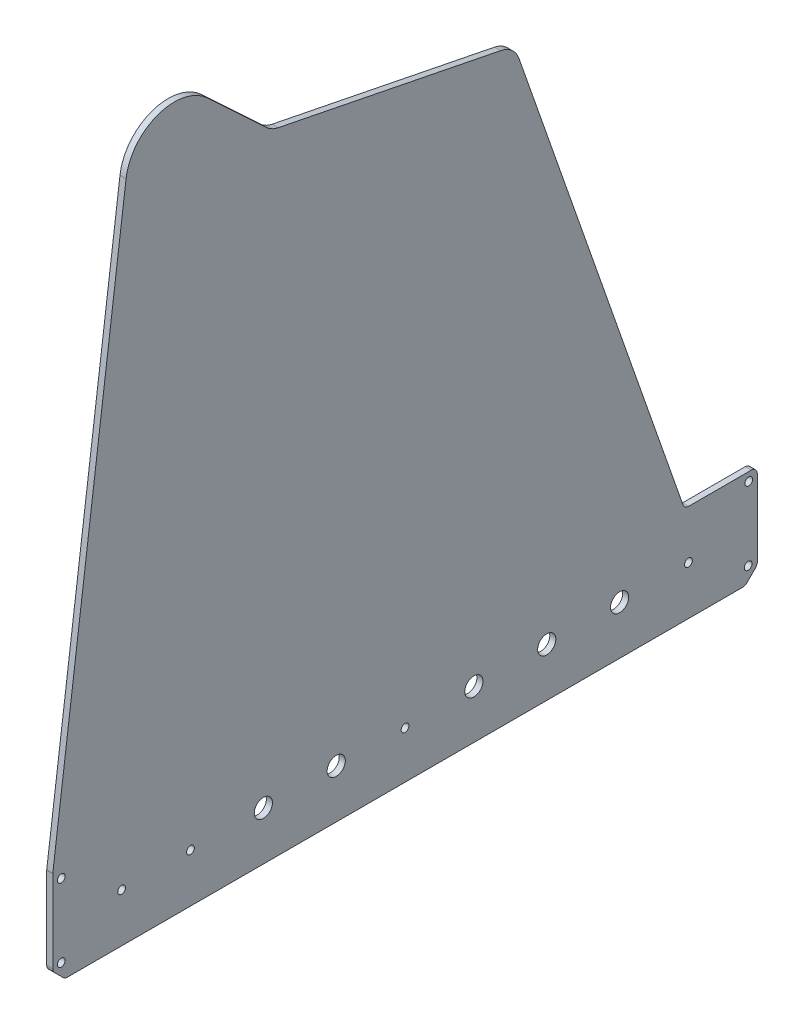
ISO-10303-21;
HEADER;
FILE_DESCRIPTION(('STEP AP214'),'2;1');
FILE_NAME('part.step','',(''),(''),'','','');
FILE_SCHEMA(('AUTOMOTIVE_DESIGN { 1 0 10303 214 1 1 1 1 }'));
ENDSEC;
DATA;
#1=APPLICATION_CONTEXT('core data for automotive mechanical design processes');
#2=APPLICATION_PROTOCOL_DEFINITION('international standard','automotive_design',2000,#1);
#3=PRODUCT_CONTEXT('',#1,'mechanical');
#4=PRODUCT('Part','Part','',(#3));
#5=PRODUCT_RELATED_PRODUCT_CATEGORY('part','',(#4));
#6=PRODUCT_DEFINITION_FORMATION('','',#4);
#7=PRODUCT_DEFINITION_CONTEXT('part definition',#1,'design');
#8=PRODUCT_DEFINITION('design','',#6,#7);
#9=PRODUCT_DEFINITION_SHAPE('','',#8);
#10=(LENGTH_UNIT() NAMED_UNIT(*) SI_UNIT(.MILLI.,.METRE.));
#11=(NAMED_UNIT(*) PLANE_ANGLE_UNIT() SI_UNIT($,.RADIAN.));
#12=(NAMED_UNIT(*) SI_UNIT($,.STERADIAN.) SOLID_ANGLE_UNIT());
#13=UNCERTAINTY_MEASURE_WITH_UNIT(LENGTH_MEASURE(1.E-05),#10,'distance_accuracy_value','');
#14=(GEOMETRIC_REPRESENTATION_CONTEXT(3) GLOBAL_UNCERTAINTY_ASSIGNED_CONTEXT((#13)) GLOBAL_UNIT_ASSIGNED_CONTEXT((#10,
#11,#12)) REPRESENTATION_CONTEXT('',''));
#15=CARTESIAN_POINT('',(0.,0.,0.));
#16=DIRECTION('',(0.,0.,1.));
#17=DIRECTION('',(1.,0.,0.));
#18=AXIS2_PLACEMENT_3D('',#15,#16,#17);
#19=CARTESIAN_POINT('',(0.,318.29375,120.65));
#20=DIRECTION('',(1.,0.,0.));
#21=DIRECTION('',(0.,0.,-1.));
#22=AXIS2_PLACEMENT_3D('',#19,#20,#21);
#23=PLANE('',#22);
#24=CARTESIAN_POINT('',(0.,21.74875,179.705));
#25=DIRECTION('',(1.,0.,0.));
#26=DIRECTION('',(0.,0.,-1.));
#27=AXIS2_PLACEMENT_3D('',#24,#25,#26);
#28=CIRCLE('',#27,2.032);
#29=CARTESIAN_POINT('',(0.,21.74875,177.673));
#30=VERTEX_POINT('',#29);
#31=EDGE_CURVE('E713',#30,#30,#28,.T.);
#32=ORIENTED_EDGE('',*,*,#31,.T.);
#33=EDGE_LOOP('',(#32));
#34=FACE_BOUND('',#33,.T.);
#35=CARTESIAN_POINT('',(0.,-16.4150707152516,179.705));
#36=DIRECTION('',(1.,0.,0.));
#37=DIRECTION('',(0.,0.,-1.));
#38=AXIS2_PLACEMENT_3D('',#35,#36,#37);
#39=CIRCLE('',#38,2.032);
#40=CARTESIAN_POINT('',(0.,-16.4150707152516,177.673));
#41=VERTEX_POINT('',#40);
#42=EDGE_CURVE('E705',#41,#41,#39,.T.);
#43=ORIENTED_EDGE('',*,*,#42,.T.);
#44=EDGE_LOOP('',(#43));
#45=FACE_BOUND('',#44,.T.);
#46=CARTESIAN_POINT('',(0.,21.74875,-179.705));
#47=DIRECTION('',(1.,0.,0.));
#48=DIRECTION('',(0.,0.,-1.));
#49=AXIS2_PLACEMENT_3D('',#46,#47,#48);
#50=CIRCLE('',#49,2.032);
#51=CARTESIAN_POINT('',(0.,21.74875,-181.737));
#52=VERTEX_POINT('',#51);
#53=EDGE_CURVE('E699',#52,#52,#50,.T.);
#54=ORIENTED_EDGE('',*,*,#53,.T.);
#55=EDGE_LOOP('',(#54));
#56=FACE_BOUND('',#55,.T.);
#57=CARTESIAN_POINT('',(0.,-16.2835579091981,-179.3875));
#58=DIRECTION('',(1.,0.,0.));
#59=DIRECTION('',(0.,0.,-1.));
#60=AXIS2_PLACEMENT_3D('',#57,#58,#59);
#61=CIRCLE('',#60,2.032);
#62=CARTESIAN_POINT('',(0.,-16.2835579091981,-181.4195));
#63=VERTEX_POINT('',#62);
#64=EDGE_CURVE('E693',#63,#63,#61,.T.);
#65=ORIENTED_EDGE('',*,*,#64,.T.);
#66=EDGE_LOOP('',(#65));
#67=FACE_BOUND('',#66,.T.);
#68=CARTESIAN_POINT('',(0.,0.793749999999986,-148.15791100584));
#69=DIRECTION('',(-1.,0.,0.));
#70=DIRECTION('',(0.,0.,1.));
#71=AXIS2_PLACEMENT_3D('',#68,#69,#70);
#72=CIRCLE('',#71,2.032);
#73=CARTESIAN_POINT('',(0.,0.793749999999986,-146.12591100584));
#74=VERTEX_POINT('',#73);
#75=EDGE_CURVE('E689',#74,#74,#72,.T.);
#76=ORIENTED_EDGE('',*,*,#75,.F.);
#77=EDGE_LOOP('',(#76));
#78=FACE_BOUND('',#77,.T.);
#79=CARTESIAN_POINT('',(0.,0.,0.));
#80=DIRECTION('',(-1.,0.,0.));
#81=DIRECTION('',(0.,0.,1.));
#82=AXIS2_PLACEMENT_3D('',#79,#80,#81);
#83=CIRCLE('',#82,2.032);
#84=CARTESIAN_POINT('',(0.,0.,2.032));
#85=VERTEX_POINT('',#84);
#86=EDGE_CURVE('E681',#85,#85,#83,.T.);
#87=ORIENTED_EDGE('',*,*,#86,.F.);
#88=EDGE_LOOP('',(#87));
#89=FACE_BOUND('',#88,.T.);
#90=CARTESIAN_POINT('',(0.,0.793750000000013,112.174577672508));
#91=DIRECTION('',(-1.,0.,0.));
#92=DIRECTION('',(0.,0.,1.));
#93=AXIS2_PLACEMENT_3D('',#90,#91,#92);
#94=CIRCLE('',#93,2.032);
#95=CARTESIAN_POINT('',(0.,0.793750000000013,114.206577672508));
#96=VERTEX_POINT('',#95);
#97=EDGE_CURVE('E673',#96,#96,#94,.T.);
#98=ORIENTED_EDGE('',*,*,#97,.F.);
#99=EDGE_LOOP('',(#98));
#100=FACE_BOUND('',#99,.T.);
#101=CARTESIAN_POINT('',(0.,0.793749999999989,-112.174577672507));
#102=DIRECTION('',(-1.,0.,0.));
#103=DIRECTION('',(0.,0.,1.));
#104=AXIS2_PLACEMENT_3D('',#101,#102,#103);
#105=CIRCLE('',#104,4.7625);
#106=CARTESIAN_POINT('',(0.,0.793749999999989,-107.412077672507));
#107=VERTEX_POINT('',#106);
#108=EDGE_CURVE('E657',#107,#107,#105,.T.);
#109=ORIENTED_EDGE('',*,*,#108,.F.);
#110=EDGE_LOOP('',(#109));
#111=FACE_BOUND('',#110,.T.);
#112=CARTESIAN_POINT('',(0.,0.793749999999994,-74.0745776725071));
#113=DIRECTION('',(-1.,0.,0.));
#114=DIRECTION('',(0.,0.,1.));
#115=AXIS2_PLACEMENT_3D('',#112,#113,#114);
#116=CIRCLE('',#115,4.7625);
#117=CARTESIAN_POINT('',(0.,0.793749999999994,-69.3120776725071));
#118=VERTEX_POINT('',#117);
#119=EDGE_CURVE('E649',#118,#118,#116,.T.);
#120=ORIENTED_EDGE('',*,*,#119,.F.);
#121=EDGE_LOOP('',(#120));
#122=FACE_BOUND('',#121,.T.);
#123=CARTESIAN_POINT('',(0.,0.793749999999999,-35.9745776725072));
#124=DIRECTION('',(-1.,0.,0.));
#125=DIRECTION('',(0.,0.,1.));
#126=AXIS2_PLACEMENT_3D('',#123,#124,#125);
#127=CIRCLE('',#126,4.7625);
#128=CARTESIAN_POINT('',(0.,0.793749999999999,-31.2120776725072));
#129=VERTEX_POINT('',#128);
#130=EDGE_CURVE('E641',#129,#129,#127,.T.);
#131=ORIENTED_EDGE('',*,*,#130,.F.);
#132=EDGE_LOOP('',(#131));
#133=FACE_BOUND('',#132,.T.);
#134=CARTESIAN_POINT('',(0.,0.793750000000013,35.974577672508));
#135=DIRECTION('',(-1.,0.,0.));
#136=DIRECTION('',(0.,0.,1.));
#137=AXIS2_PLACEMENT_3D('',#134,#135,#136);
#138=CIRCLE('',#137,4.7625);
#139=CARTESIAN_POINT('',(0.,0.793750000000013,40.737077672508));
#140=VERTEX_POINT('',#139);
#141=EDGE_CURVE('E631',#140,#140,#138,.T.);
#142=ORIENTED_EDGE('',*,*,#141,.F.);
#143=EDGE_LOOP('',(#142));
#144=FACE_BOUND('',#143,.T.);
#145=CARTESIAN_POINT('',(0.,0.793750000000015,74.0745776725079));
#146=DIRECTION('',(-1.,0.,0.));
#147=DIRECTION('',(0.,0.,1.));
#148=AXIS2_PLACEMENT_3D('',#145,#146,#147);
#149=CIRCLE('',#148,4.7625);
#150=CARTESIAN_POINT('',(0.,0.793750000000015,78.8370776725079));
#151=VERTEX_POINT('',#150);
#152=EDGE_CURVE('E623',#151,#151,#149,.T.);
#153=ORIENTED_EDGE('',*,*,#152,.F.);
#154=EDGE_LOOP('',(#153));
#155=FACE_BOUND('',#154,.T.);
#156=DIRECTION('',(0.,1.,0.));
#157=VECTOR('',#156,1.);
#158=CARTESIAN_POINT('',(0.,-24.60625,-184.15));
#159=LINE('',#158,#157);
#160=CARTESIAN_POINT('',(0.,-16.9411219394655,-184.15));
#161=VERTEX_POINT('',#160);
#162=CARTESIAN_POINT('',(0.,23.01875,-184.15));
#163=VERTEX_POINT('',#162);
#164=EDGE_CURVE('E246',#161,#163,#159,.T.);
#165=ORIENTED_EDGE('',*,*,#164,.F.);
#166=CARTESIAN_POINT('',(0.,-16.9411219394655,-180.975));
#167=DIRECTION('',(1.,0.,0.));
#168=DIRECTION('',(0.,0.,-1.));
#169=AXIS2_PLACEMENT_3D('',#166,#167,#168);
#170=CIRCLE('',#169,3.175);
#171=CARTESIAN_POINT('',(0.,-19.1861859697328,-183.220064030267));
#172=VERTEX_POINT('',#171);
#173=EDGE_CURVE('E344',#161,#172,#170,.F.);
#174=ORIENTED_EDGE('',*,*,#173,.T.);
#175=DIRECTION('',(0.,0.707106781186548,-0.707106781186548));
#176=VECTOR('',#175,1.);
#177=CARTESIAN_POINT('',(0.,-18.25625,-184.15));
#178=LINE('',#177,#176);
#179=CARTESIAN_POINT('',(0.,-23.6763140302673,-178.729935969733));
#180=VERTEX_POINT('',#179);
#181=EDGE_CURVE('E225',#172,#180,#178,.F.);
#182=ORIENTED_EDGE('',*,*,#181,.T.);
#183=CARTESIAN_POINT('',(0.,-21.43125,-176.484871939465));
#184=DIRECTION('',(1.,0.,0.));
#185=DIRECTION('',(0.,0.,-1.));
#186=AXIS2_PLACEMENT_3D('',#183,#184,#185);
#187=CIRCLE('',#186,3.175);
#188=CARTESIAN_POINT('',(0.,-24.60625,-176.484871939465));
#189=VERTEX_POINT('',#188);
#190=EDGE_CURVE('E342',#180,#189,#187,.F.);
#191=ORIENTED_EDGE('',*,*,#190,.T.);
#192=DIRECTION('',(0.,0.,-1.));
#193=VECTOR('',#192,1.);
#194=CARTESIAN_POINT('',(0.,-24.60625,184.15));
#195=LINE('',#194,#193);
#196=CARTESIAN_POINT('',(0.,-24.60625,176.484871939465));
#197=VERTEX_POINT('',#196);
#198=EDGE_CURVE('E241',#197,#189,#195,.T.);
#199=ORIENTED_EDGE('',*,*,#198,.F.);
#200=CARTESIAN_POINT('',(0.,-21.43125,176.484871939465));
#201=DIRECTION('',(1.,0.,0.));
#202=DIRECTION('',(0.,0.,-1.));
#203=AXIS2_PLACEMENT_3D('',#200,#201,#202);
#204=CIRCLE('',#203,3.175);
#205=CARTESIAN_POINT('',(0.,-23.6763140302673,178.729935969733));
#206=VERTEX_POINT('',#205);
#207=EDGE_CURVE('E336',#197,#206,#204,.F.);
#208=ORIENTED_EDGE('',*,*,#207,.T.);
#209=DIRECTION('',(0.,-0.707106781186551,-0.707106781186544));
#210=VECTOR('',#209,1.);
#211=CARTESIAN_POINT('',(0.,-24.60625,177.8));
#212=LINE('',#211,#210);
#213=CARTESIAN_POINT('',(0.,-19.1861859697326,183.220064030267));
#214=VERTEX_POINT('',#213);
#215=EDGE_CURVE('E269',#206,#214,#212,.F.);
#216=ORIENTED_EDGE('',*,*,#215,.T.);
#217=CARTESIAN_POINT('',(0.,-16.9411219394654,180.975));
#218=DIRECTION('',(1.,0.,0.));
#219=DIRECTION('',(0.,0.,-1.));
#220=AXIS2_PLACEMENT_3D('',#217,#218,#219);
#221=CIRCLE('',#220,3.175);
#222=CARTESIAN_POINT('',(0.,-16.9411219394654,184.15));
#223=VERTEX_POINT('',#222);
#224=EDGE_CURVE('E339',#214,#223,#221,.F.);
#225=ORIENTED_EDGE('',*,*,#224,.T.);
#226=DIRECTION('',(0.,-1.,0.));
#227=VECTOR('',#226,1.);
#228=CARTESIAN_POINT('',(0.,26.19375,184.15));
#229=LINE('',#228,#227);
#230=CARTESIAN_POINT('',(0.,25.9886999732577,184.15));
#231=VERTEX_POINT('',#230);
#232=EDGE_CURVE('E237',#231,#223,#229,.T.);
#233=ORIENTED_EDGE('',*,*,#232,.F.);
#234=CARTESIAN_POINT('',(0.,25.9886999732577,180.975));
#235=DIRECTION('',(1.,0.,0.));
#236=DIRECTION('',(0.,0.,-1.));
#237=AXIS2_PLACEMENT_3D('',#234,#235,#236);
#238=CIRCLE('',#237,3.175);
#239=CARTESIAN_POINT('',(0.,26.3970966355969,184.123624646761));
#240=VERTEX_POINT('',#239);
#241=EDGE_CURVE('E303',#231,#240,#238,.F.);
#242=ORIENTED_EDGE('',*,*,#241,.T.);
#243=DIRECTION('',(0.,-0.991692802129412,0.128628870028133));
#244=VECTOR('',#243,1.);
#245=CARTESIAN_POINT('',(0.,321.560923298715,145.838997174087));
#246=LINE('',#245,#244);
#247=CARTESIAN_POINT('',(0.,321.560923298715,145.838997174087));
#248=VERTEX_POINT('',#247);
#249=EDGE_CURVE('E261',#248,#240,#246,.T.);
#250=ORIENTED_EDGE('',*,*,#249,.F.);
#251=CARTESIAN_POINT('',(0.,318.29375,120.65));
#252=DIRECTION('',(1.,0.,0.));
#253=DIRECTION('',(0.,0.,-1.));
#254=AXIS2_PLACEMENT_3D('',#251,#252,#253);
#255=CIRCLE('',#254,25.4);
#256=CARTESIAN_POINT('',(0.,336.853985858067,103.309941035483));
#257=VERTEX_POINT('',#256);
#258=EDGE_CURVE('E259',#257,#248,#255,.T.);
#259=ORIENTED_EDGE('',*,*,#258,.F.);
#260=DIRECTION('',(0.,0.682679486791999,0.730717947167998));
#261=VECTOR('',#260,1.);
#262=CARTESIAN_POINT('',(0.,305.59375,69.85));
#263=LINE('',#262,#261);
#264=CARTESIAN_POINT('',(0.,308.058847877995,72.4885606947722));
#265=VERTEX_POINT('',#264);
#266=EDGE_CURVE('E222',#265,#257,#263,.T.);
#267=ORIENTED_EDGE('',*,*,#266,.F.);
#268=CARTESIAN_POINT('',(0.,317.338965807028,63.8185312125138));
#269=DIRECTION('',(1.,0.,0.));
#270=DIRECTION('',(0.,0.,-1.));
#271=AXIS2_PLACEMENT_3D('',#268,#269,#270);
#272=CIRCLE('',#271,12.7);
#273=CARTESIAN_POINT('',(0.,304.885591225754,66.3092061287687));
#274=VERTEX_POINT('',#273);
#275=EDGE_CURVE('E293',#265,#274,#272,.T.);
#276=ORIENTED_EDGE('',*,*,#275,.T.);
#277=DIRECTION('',(0.,0.196116135138184,0.98058067569092));
#278=VECTOR('',#277,1.);
#279=CARTESIAN_POINT('',(0.,280.19375,-57.15));
#280=LINE('',#279,#278);
#281=CARTESIAN_POINT('',(0.,281.6144065041,-50.0467174795013));
#282=VERTEX_POINT('',#281);
#283=EDGE_CURVE('E255',#282,#274,#280,.T.);
#284=ORIENTED_EDGE('',*,*,#283,.F.);
#285=CARTESIAN_POINT('',(0.,269.161031922825,-47.5560425632464));
#286=DIRECTION('',(1.,0.,0.));
#287=DIRECTION('',(0.,0.,-1.));
#288=AXIS2_PLACEMENT_3D('',#285,#286,#287);
#289=CIRCLE('',#288,12.7);
#290=CARTESIAN_POINT('',(0.,273.356482316872,-59.5430436890948));
#291=VERTEX_POINT('',#290);
#292=EDGE_CURVE('E285',#282,#291,#289,.F.);
#293=ORIENTED_EDGE('',*,*,#292,.T.);
#294=DIRECTION('',(0.,0.943858356366017,0.330350424728106));
#295=VECTOR('',#294,1.);
#296=CARTESIAN_POINT('',(0.,26.19375,-146.05));
#297=LINE('',#296,#295);
#298=CARTESIAN_POINT('',(0.,28.3198874014883,-145.305851909479));
#299=VERTEX_POINT('',#298);
#300=EDGE_CURVE('E252',#299,#291,#297,.T.);
#301=ORIENTED_EDGE('',*,*,#300,.F.);
#302=CARTESIAN_POINT('',(0.,29.36875,-148.302602190941));
#303=DIRECTION('',(1.,0.,0.));
#304=DIRECTION('',(0.,0.,-1.));
#305=AXIS2_PLACEMENT_3D('',#302,#303,#304);
#306=CIRCLE('',#305,3.175);
#307=CARTESIAN_POINT('',(0.,26.19375,-148.302602190941));
#308=VERTEX_POINT('',#307);
#309=EDGE_CURVE('E327',#299,#308,#306,.T.);
#310=ORIENTED_EDGE('',*,*,#309,.T.);
#311=DIRECTION('',(0.,0.,1.));
#312=VECTOR('',#311,1.);
#313=CARTESIAN_POINT('',(0.,26.19375,-184.15));
#314=LINE('',#313,#312);
#315=CARTESIAN_POINT('',(0.,26.19375,-180.975));
#316=VERTEX_POINT('',#315);
#317=EDGE_CURVE('E248',#316,#308,#314,.T.);
#318=ORIENTED_EDGE('',*,*,#317,.F.);
#319=CARTESIAN_POINT('',(0.,23.01875,-180.975));
#320=DIRECTION('',(1.,0.,0.));
#321=DIRECTION('',(0.,0.,-1.));
#322=AXIS2_PLACEMENT_3D('',#319,#320,#321);
#323=CIRCLE('',#322,3.175);
#324=EDGE_CURVE('E300',#316,#163,#323,.F.);
#325=ORIENTED_EDGE('',*,*,#324,.T.);
#326=EDGE_LOOP('',(#165,#174,#182,#191,#199,#208,#216,#225,#233,#242,#250,#259,#267,#276,#284,
#293,#301,#310,#318,#325));
#327=FACE_BOUND('',#326,.T.);
#328=CARTESIAN_POINT('',(0.,0.793750000000013,148.157911005841));
#329=DIRECTION('',(-1.,0.,0.));
#330=DIRECTION('',(0.,0.,1.));
#331=AXIS2_PLACEMENT_3D('',#328,#329,#330);
#332=CIRCLE('',#331,2.032);
#333=CARTESIAN_POINT('',(0.,0.793750000000013,150.189911005841));
#334=VERTEX_POINT('',#333);
#335=EDGE_CURVE('E665',#334,#334,#332,.T.);
#336=ORIENTED_EDGE('',*,*,#335,.F.);
#337=EDGE_LOOP('',(#336));
#338=FACE_BOUND('',#337,.T.);
#339=ADVANCED_FACE('F47',(#34,#45,#56,#67,#78,#89,#100,#111,#122,#133,#144,#155,#327,#338),#23,.F.);
#340=CARTESIAN_POINT('',(3.175,318.29375,120.65));
#341=DIRECTION('',(1.,0.,0.));
#342=DIRECTION('',(0.,0.,-1.));
#343=AXIS2_PLACEMENT_3D('',#340,#341,#342);
#344=PLANE('',#343);
#345=CARTESIAN_POINT('',(3.175,21.74875,179.705));
#346=DIRECTION('',(1.,0.,0.));
#347=DIRECTION('',(0.,0.,-1.));
#348=AXIS2_PLACEMENT_3D('',#345,#346,#347);
#349=CIRCLE('',#348,2.032);
#350=CARTESIAN_POINT('',(3.175,21.74875,177.673));
#351=VERTEX_POINT('',#350);
#352=EDGE_CURVE('E716',#351,#351,#349,.T.);
#353=ORIENTED_EDGE('',*,*,#352,.F.);
#354=EDGE_LOOP('',(#353));
#355=FACE_BOUND('',#354,.T.);
#356=CARTESIAN_POINT('',(3.175,-16.4150707152516,179.705));
#357=DIRECTION('',(1.,0.,0.));
#358=DIRECTION('',(0.,0.,-1.));
#359=AXIS2_PLACEMENT_3D('',#356,#357,#358);
#360=CIRCLE('',#359,2.032);
#361=CARTESIAN_POINT('',(3.175,-16.4150707152516,177.673));
#362=VERTEX_POINT('',#361);
#363=EDGE_CURVE('E709',#362,#362,#360,.T.);
#364=ORIENTED_EDGE('',*,*,#363,.F.);
#365=EDGE_LOOP('',(#364));
#366=FACE_BOUND('',#365,.T.);
#367=CARTESIAN_POINT('',(3.175,21.74875,-179.705));
#368=DIRECTION('',(1.,0.,0.));
#369=DIRECTION('',(0.,0.,-1.));
#370=AXIS2_PLACEMENT_3D('',#367,#368,#369);
#371=CIRCLE('',#370,2.032);
#372=CARTESIAN_POINT('',(3.175,21.74875,-181.737));
#373=VERTEX_POINT('',#372);
#374=EDGE_CURVE('E702',#373,#373,#371,.T.);
#375=ORIENTED_EDGE('',*,*,#374,.F.);
#376=EDGE_LOOP('',(#375));
#377=FACE_BOUND('',#376,.T.);
#378=CARTESIAN_POINT('',(3.175,-16.2835579091981,-179.3875));
#379=DIRECTION('',(1.,0.,0.));
#380=DIRECTION('',(0.,0.,-1.));
#381=AXIS2_PLACEMENT_3D('',#378,#379,#380);
#382=CIRCLE('',#381,2.032);
#383=CARTESIAN_POINT('',(3.175,-16.2835579091981,-181.4195));
#384=VERTEX_POINT('',#383);
#385=EDGE_CURVE('E696',#384,#384,#382,.T.);
#386=ORIENTED_EDGE('',*,*,#385,.F.);
#387=EDGE_LOOP('',(#386));
#388=FACE_BOUND('',#387,.T.);
#389=CARTESIAN_POINT('',(3.175,0.793749999999986,-148.15791100584));
#390=DIRECTION('',(-1.,0.,0.));
#391=DIRECTION('',(0.,0.,1.));
#392=AXIS2_PLACEMENT_3D('',#389,#390,#391);
#393=CIRCLE('',#392,2.032);
#394=CARTESIAN_POINT('',(3.175,0.793749999999986,-146.12591100584));
#395=VERTEX_POINT('',#394);
#396=EDGE_CURVE('E685',#395,#395,#393,.T.);
#397=ORIENTED_EDGE('',*,*,#396,.T.);
#398=EDGE_LOOP('',(#397));
#399=FACE_BOUND('',#398,.T.);
#400=CARTESIAN_POINT('',(3.175,0.,0.));
#401=DIRECTION('',(-1.,0.,0.));
#402=DIRECTION('',(0.,0.,1.));
#403=AXIS2_PLACEMENT_3D('',#400,#401,#402);
#404=CIRCLE('',#403,2.032);
#405=CARTESIAN_POINT('',(3.175,0.,2.032));
#406=VERTEX_POINT('',#405);
#407=EDGE_CURVE('E677',#406,#406,#404,.T.);
#408=ORIENTED_EDGE('',*,*,#407,.T.);
#409=EDGE_LOOP('',(#408));
#410=FACE_BOUND('',#409,.T.);
#411=CARTESIAN_POINT('',(3.175,0.793750000000013,112.174577672508));
#412=DIRECTION('',(-1.,0.,0.));
#413=DIRECTION('',(0.,0.,1.));
#414=AXIS2_PLACEMENT_3D('',#411,#412,#413);
#415=CIRCLE('',#414,2.032);
#416=CARTESIAN_POINT('',(3.175,0.793750000000013,114.206577672508));
#417=VERTEX_POINT('',#416);
#418=EDGE_CURVE('E669',#417,#417,#415,.T.);
#419=ORIENTED_EDGE('',*,*,#418,.T.);
#420=EDGE_LOOP('',(#419));
#421=FACE_BOUND('',#420,.T.);
#422=CARTESIAN_POINT('',(3.175,0.793750000000013,148.157911005841));
#423=DIRECTION('',(-1.,0.,0.));
#424=DIRECTION('',(0.,0.,1.));
#425=AXIS2_PLACEMENT_3D('',#422,#423,#424);
#426=CIRCLE('',#425,2.032);
#427=CARTESIAN_POINT('',(3.175,0.793750000000013,150.189911005841));
#428=VERTEX_POINT('',#427);
#429=EDGE_CURVE('E661',#428,#428,#426,.T.);
#430=ORIENTED_EDGE('',*,*,#429,.T.);
#431=EDGE_LOOP('',(#430));
#432=FACE_BOUND('',#431,.T.);
#433=CARTESIAN_POINT('',(3.175,0.793749999999989,-112.174577672507));
#434=DIRECTION('',(-1.,0.,0.));
#435=DIRECTION('',(0.,0.,1.));
#436=AXIS2_PLACEMENT_3D('',#433,#434,#435);
#437=CIRCLE('',#436,4.7625);
#438=CARTESIAN_POINT('',(3.175,0.793749999999989,-107.412077672507));
#439=VERTEX_POINT('',#438);
#440=EDGE_CURVE('E653',#439,#439,#437,.T.);
#441=ORIENTED_EDGE('',*,*,#440,.T.);
#442=EDGE_LOOP('',(#441));
#443=FACE_BOUND('',#442,.T.);
#444=CARTESIAN_POINT('',(3.175,0.793749999999994,-74.0745776725071));
#445=DIRECTION('',(-1.,0.,0.));
#446=DIRECTION('',(0.,0.,1.));
#447=AXIS2_PLACEMENT_3D('',#444,#445,#446);
#448=CIRCLE('',#447,4.7625);
#449=CARTESIAN_POINT('',(3.175,0.793749999999994,-69.3120776725071));
#450=VERTEX_POINT('',#449);
#451=EDGE_CURVE('E645',#450,#450,#448,.T.);
#452=ORIENTED_EDGE('',*,*,#451,.T.);
#453=EDGE_LOOP('',(#452));
#454=FACE_BOUND('',#453,.T.);
#455=CARTESIAN_POINT('',(3.175,0.793749999999999,-35.9745776725072));
#456=DIRECTION('',(-1.,0.,0.));
#457=DIRECTION('',(0.,0.,1.));
#458=AXIS2_PLACEMENT_3D('',#455,#456,#457);
#459=CIRCLE('',#458,4.7625);
#460=CARTESIAN_POINT('',(3.175,0.793749999999999,-31.2120776725072));
#461=VERTEX_POINT('',#460);
#462=EDGE_CURVE('E637',#461,#461,#459,.T.);
#463=ORIENTED_EDGE('',*,*,#462,.T.);
#464=EDGE_LOOP('',(#463));
#465=FACE_BOUND('',#464,.T.);
#466=DIRECTION('',(0.,-0.707106781186548,0.707106781186548));
#467=VECTOR('',#466,1.);
#468=CARTESIAN_POINT('',(3.175,-2.38125,-200.025));
#469=LINE('',#468,#467);
#470=CARTESIAN_POINT('',(3.175,-23.6763140302673,-178.729935969733));
#471=VERTEX_POINT('',#470);
#472=CARTESIAN_POINT('',(3.175,-19.1861859697327,-183.220064030267));
#473=VERTEX_POINT('',#472);
#474=EDGE_CURVE('E273',#471,#473,#469,.F.);
#475=ORIENTED_EDGE('',*,*,#474,.T.);
#476=CARTESIAN_POINT('',(3.175,-16.9411219394655,-180.975));
#477=DIRECTION('',(1.,0.,0.));
#478=DIRECTION('',(0.,0.,-1.));
#479=AXIS2_PLACEMENT_3D('',#476,#477,#478);
#480=CIRCLE('',#479,3.175);
#481=CARTESIAN_POINT('',(3.175,-16.9411219394655,-184.15));
#482=VERTEX_POINT('',#481);
#483=EDGE_CURVE('E356',#473,#482,#480,.T.);
#484=ORIENTED_EDGE('',*,*,#483,.T.);
#485=DIRECTION('',(0.,1.,0.));
#486=VECTOR('',#485,1.);
#487=CARTESIAN_POINT('',(3.175,-24.60625,-184.15));
#488=LINE('',#487,#486);
#489=CARTESIAN_POINT('',(3.175,23.01875,-184.15));
#490=VERTEX_POINT('',#489);
#491=EDGE_CURVE('E389',#482,#490,#488,.T.);
#492=ORIENTED_EDGE('',*,*,#491,.T.);
#493=CARTESIAN_POINT('',(3.175,23.01875,-180.975));
#494=DIRECTION('',(1.,0.,0.));
#495=DIRECTION('',(0.,0.,-1.));
#496=AXIS2_PLACEMENT_3D('',#493,#494,#495);
#497=CIRCLE('',#496,3.175);
#498=CARTESIAN_POINT('',(3.175,26.19375,-180.975));
#499=VERTEX_POINT('',#498);
#500=EDGE_CURVE('E309',#490,#499,#497,.T.);
#501=ORIENTED_EDGE('',*,*,#500,.T.);
#502=DIRECTION('',(0.,0.,1.));
#503=VECTOR('',#502,1.);
#504=CARTESIAN_POINT('',(3.175,26.19375,-184.15));
#505=LINE('',#504,#503);
#506=CARTESIAN_POINT('',(3.175,26.19375,-148.302602190941));
#507=VERTEX_POINT('',#506);
#508=EDGE_CURVE('E391',#499,#507,#505,.T.);
#509=ORIENTED_EDGE('',*,*,#508,.T.);
#510=CARTESIAN_POINT('',(3.175,29.36875,-148.302602190941));
#511=DIRECTION('',(1.,0.,0.));
#512=DIRECTION('',(0.,0.,-1.));
#513=AXIS2_PLACEMENT_3D('',#510,#511,#512);
#514=CIRCLE('',#513,3.175);
#515=CARTESIAN_POINT('',(3.175,28.3198874014883,-145.305851909479));
#516=VERTEX_POINT('',#515);
#517=EDGE_CURVE('E330',#507,#516,#514,.F.);
#518=ORIENTED_EDGE('',*,*,#517,.T.);
#519=DIRECTION('',(0.,0.943858356366017,0.330350424728106));
#520=VECTOR('',#519,1.);
#521=CARTESIAN_POINT('',(3.175,26.19375,-146.05));
#522=LINE('',#521,#520);
#523=CARTESIAN_POINT('',(3.175,273.356482316872,-59.5430436890948));
#524=VERTEX_POINT('',#523);
#525=EDGE_CURVE('E400',#516,#524,#522,.T.);
#526=ORIENTED_EDGE('',*,*,#525,.T.);
#527=CARTESIAN_POINT('',(3.175,269.161031922825,-47.5560425632464));
#528=DIRECTION('',(1.,0.,0.));
#529=DIRECTION('',(0.,0.,-1.));
#530=AXIS2_PLACEMENT_3D('',#527,#528,#529);
#531=CIRCLE('',#530,12.7);
#532=CARTESIAN_POINT('',(3.175,281.6144065041,-50.0467174795013));
#533=VERTEX_POINT('',#532);
#534=EDGE_CURVE('E291',#524,#533,#531,.T.);
#535=ORIENTED_EDGE('',*,*,#534,.T.);
#536=DIRECTION('',(0.,0.196116135138184,0.98058067569092));
#537=VECTOR('',#536,1.);
#538=CARTESIAN_POINT('',(3.175,280.19375,-57.15));
#539=LINE('',#538,#537);
#540=CARTESIAN_POINT('',(3.175,304.885591225754,66.3092061287687));
#541=VERTEX_POINT('',#540);
#542=EDGE_CURVE('E216',#533,#541,#539,.T.);
#543=ORIENTED_EDGE('',*,*,#542,.T.);
#544=CARTESIAN_POINT('',(3.175,317.338965807028,63.8185312125138));
#545=DIRECTION('',(1.,0.,0.));
#546=DIRECTION('',(0.,0.,-1.));
#547=AXIS2_PLACEMENT_3D('',#544,#545,#546);
#548=CIRCLE('',#547,12.7);
#549=CARTESIAN_POINT('',(3.175,308.058847877995,72.4885606947722));
#550=VERTEX_POINT('',#549);
#551=EDGE_CURVE('E212',#541,#550,#548,.F.);
#552=ORIENTED_EDGE('',*,*,#551,.T.);
#553=DIRECTION('',(0.,0.682679486791999,0.730717947167998));
#554=VECTOR('',#553,1.);
#555=CARTESIAN_POINT('',(3.175,305.59375,69.85));
#556=LINE('',#555,#554);
#557=CARTESIAN_POINT('',(3.175,336.853985858067,103.309941035483));
#558=VERTEX_POINT('',#557);
#559=EDGE_CURVE('E201',#550,#558,#556,.T.);
#560=ORIENTED_EDGE('',*,*,#559,.T.);
#561=CARTESIAN_POINT('',(3.175,318.29375,120.65));
#562=DIRECTION('',(1.,0.,0.));
#563=DIRECTION('',(0.,0.,-1.));
#564=AXIS2_PLACEMENT_3D('',#561,#562,#563);
#565=CIRCLE('',#564,25.4);
#566=CARTESIAN_POINT('',(3.175,321.560923298715,145.838997174087));
#567=VERTEX_POINT('',#566);
#568=EDGE_CURVE('E208',#558,#567,#565,.T.);
#569=ORIENTED_EDGE('',*,*,#568,.T.);
#570=DIRECTION('',(0.,-0.991692802129412,0.128628870028133));
#571=VECTOR('',#570,1.);
#572=CARTESIAN_POINT('',(3.175,321.560923298715,145.838997174087));
#573=LINE('',#572,#571);
#574=CARTESIAN_POINT('',(3.175,26.3970966355969,184.123624646761));
#575=VERTEX_POINT('',#574);
#576=EDGE_CURVE('E231',#567,#575,#573,.T.);
#577=ORIENTED_EDGE('',*,*,#576,.T.);
#578=CARTESIAN_POINT('',(3.175,25.9886999732577,180.975));
#579=DIRECTION('',(1.,0.,0.));
#580=DIRECTION('',(0.,0.,-1.));
#581=AXIS2_PLACEMENT_3D('',#578,#579,#580);
#582=CIRCLE('',#581,3.175);
#583=CARTESIAN_POINT('',(3.175,25.9886999732577,184.15));
#584=VERTEX_POINT('',#583);
#585=EDGE_CURVE('E311',#575,#584,#582,.T.);
#586=ORIENTED_EDGE('',*,*,#585,.T.);
#587=DIRECTION('',(0.,-1.,0.));
#588=VECTOR('',#587,1.);
#589=CARTESIAN_POINT('',(3.175,26.19375,184.15));
#590=LINE('',#589,#588);
#591=CARTESIAN_POINT('',(3.175,-16.9411219394654,184.15));
#592=VERTEX_POINT('',#591);
#593=EDGE_CURVE('E265',#584,#592,#590,.T.);
#594=ORIENTED_EDGE('',*,*,#593,.T.);
#595=CARTESIAN_POINT('',(3.175,-16.9411219394654,180.975));
#596=DIRECTION('',(1.,0.,0.));
#597=DIRECTION('',(0.,0.,-1.));
#598=AXIS2_PLACEMENT_3D('',#595,#596,#597);
#599=CIRCLE('',#598,3.175);
#600=CARTESIAN_POINT('',(3.175,-19.1861859697326,183.220064030267));
#601=VERTEX_POINT('',#600);
#602=EDGE_CURVE('E352',#592,#601,#599,.T.);
#603=ORIENTED_EDGE('',*,*,#602,.T.);
#604=DIRECTION('',(0.,0.707106781186551,0.707106781186544));
#605=VECTOR('',#604,1.);
#606=CARTESIAN_POINT('',(3.175,118.268750000002,320.675));
#607=LINE('',#606,#605);
#608=CARTESIAN_POINT('',(3.175,-23.6763140302673,178.729935969733));
#609=VERTEX_POINT('',#608);
#610=EDGE_CURVE('E275',#601,#609,#607,.F.);
#611=ORIENTED_EDGE('',*,*,#610,.T.);
#612=CARTESIAN_POINT('',(3.175,-21.43125,176.484871939465));
#613=DIRECTION('',(1.,0.,0.));
#614=DIRECTION('',(0.,0.,-1.));
#615=AXIS2_PLACEMENT_3D('',#612,#613,#614);
#616=CIRCLE('',#615,3.175);
#617=CARTESIAN_POINT('',(3.175,-24.60625,176.484871939465));
#618=VERTEX_POINT('',#617);
#619=EDGE_CURVE('E74',#609,#618,#616,.T.);
#620=ORIENTED_EDGE('',*,*,#619,.T.);
#621=DIRECTION('',(0.,0.,-1.));
#622=VECTOR('',#621,1.);
#623=CARTESIAN_POINT('',(3.175,-24.60625,184.15));
#624=LINE('',#623,#622);
#625=CARTESIAN_POINT('',(3.175,-24.60625,-176.484871939465));
#626=VERTEX_POINT('',#625);
#627=EDGE_CURVE('E381',#618,#626,#624,.T.);
#628=ORIENTED_EDGE('',*,*,#627,.T.);
#629=CARTESIAN_POINT('',(3.175,-21.43125,-176.484871939465));
#630=DIRECTION('',(1.,0.,0.));
#631=DIRECTION('',(0.,0.,-1.));
#632=AXIS2_PLACEMENT_3D('',#629,#630,#631);
#633=CIRCLE('',#632,3.175);
#634=EDGE_CURVE('E63',#626,#471,#633,.T.);
#635=ORIENTED_EDGE('',*,*,#634,.T.);
#636=EDGE_LOOP('',(#475,#484,#492,#501,#509,#518,#526,#535,#543,#552,#560,#569,#577,#586,#594,
#603,#611,#620,#628,#635));
#637=FACE_BOUND('',#636,.T.);
#638=CARTESIAN_POINT('',(3.175,0.793750000000015,74.0745776725079));
#639=DIRECTION('',(-1.,0.,0.));
#640=DIRECTION('',(0.,0.,1.));
#641=AXIS2_PLACEMENT_3D('',#638,#639,#640);
#642=CIRCLE('',#641,4.7625);
#643=CARTESIAN_POINT('',(3.175,0.793750000000015,78.8370776725079));
#644=VERTEX_POINT('',#643);
#645=EDGE_CURVE('E242',#644,#644,#642,.T.);
#646=ORIENTED_EDGE('',*,*,#645,.T.);
#647=EDGE_LOOP('',(#646));
#648=FACE_BOUND('',#647,.T.);
#649=CARTESIAN_POINT('',(3.175,0.793750000000013,35.974577672508));
#650=DIRECTION('',(-1.,0.,0.));
#651=DIRECTION('',(0.,0.,1.));
#652=AXIS2_PLACEMENT_3D('',#649,#650,#651);
#653=CIRCLE('',#652,4.7625);
#654=CARTESIAN_POINT('',(3.175,0.793750000000013,40.737077672508));
#655=VERTEX_POINT('',#654);
#656=EDGE_CURVE('E626',#655,#655,#653,.T.);
#657=ORIENTED_EDGE('',*,*,#656,.T.);
#658=EDGE_LOOP('',(#657));
#659=FACE_BOUND('',#658,.T.);
#660=ADVANCED_FACE('F204',(#355,#366,#377,#388,#399,#410,#421,#432,#443,#454,#465,#637,#648,
#659),#344,.T.);
#661=CARTESIAN_POINT('',(3.175,26.19375,184.15));
#662=DIRECTION('',(0.,0.,-1.));
#663=DIRECTION('',(-1.,0.,0.));
#664=AXIS2_PLACEMENT_3D('',#661,#662,#663);
#665=PLANE('',#664);
#666=ORIENTED_EDGE('',*,*,#232,.T.);
#667=DIRECTION('',(-1.,0.,0.));
#668=VECTOR('',#667,1.);
#669=CARTESIAN_POINT('',(3.175,-16.9411219394654,184.15));
#670=LINE('',#669,#668);
#671=EDGE_CURVE('E364',#223,#592,#670,.F.);
#672=ORIENTED_EDGE('',*,*,#671,.T.);
#673=ORIENTED_EDGE('',*,*,#593,.F.);
#674=DIRECTION('',(-1.,0.,0.));
#675=VECTOR('',#674,1.);
#676=CARTESIAN_POINT('',(3.175,25.9886999732577,184.15));
#677=LINE('',#676,#675);
#678=EDGE_CURVE('E296',#584,#231,#677,.T.);
#679=ORIENTED_EDGE('',*,*,#678,.T.);
#680=EDGE_LOOP('',(#666,#672,#673,#679));
#681=FACE_BOUND('',#680,.T.);
#682=ADVANCED_FACE('F421',(#681),#665,.F.);
#683=CARTESIAN_POINT('',(3.175,-24.60625,184.15));
#684=DIRECTION('',(0.,1.,0.));
#685=DIRECTION('',(0.,0.,1.));
#686=AXIS2_PLACEMENT_3D('',#683,#684,#685);
#687=PLANE('',#686);
#688=ORIENTED_EDGE('',*,*,#198,.T.);
#689=DIRECTION('',(-1.,0.,0.));
#690=VECTOR('',#689,1.);
#691=CARTESIAN_POINT('',(3.175,-24.60625,-176.484871939465));
#692=LINE('',#691,#690);
#693=EDGE_CURVE('E362',#189,#626,#692,.F.);
#694=ORIENTED_EDGE('',*,*,#693,.T.);
#695=ORIENTED_EDGE('',*,*,#627,.F.);
#696=DIRECTION('',(1.,0.,0.));
#697=VECTOR('',#696,1.);
#698=CARTESIAN_POINT('',(0.,-24.60625,176.484871939465));
#699=LINE('',#698,#697);
#700=EDGE_CURVE('E358',#618,#197,#699,.F.);
#701=ORIENTED_EDGE('',*,*,#700,.T.);
#702=EDGE_LOOP('',(#688,#694,#695,#701));
#703=FACE_BOUND('',#702,.T.);
#704=ADVANCED_FACE('F380',(#703),#687,.F.);
#705=CARTESIAN_POINT('',(3.175,-24.60625,-184.15));
#706=DIRECTION('',(0.,0.,1.));
#707=DIRECTION('',(1.,0.,0.));
#708=AXIS2_PLACEMENT_3D('',#705,#706,#707);
#709=PLANE('',#708);
#710=ORIENTED_EDGE('',*,*,#491,.F.);
#711=DIRECTION('',(1.,0.,0.));
#712=VECTOR('',#711,1.);
#713=CARTESIAN_POINT('',(0.,-16.9411219394655,-184.15));
#714=LINE('',#713,#712);
#715=EDGE_CURVE('E333',#482,#161,#714,.F.);
#716=ORIENTED_EDGE('',*,*,#715,.T.);
#717=ORIENTED_EDGE('',*,*,#164,.T.);
#718=DIRECTION('',(-1.,0.,0.));
#719=VECTOR('',#718,1.);
#720=CARTESIAN_POINT('',(3.175,23.01875,-184.15));
#721=LINE('',#720,#719);
#722=EDGE_CURVE('E320',#163,#490,#721,.F.);
#723=ORIENTED_EDGE('',*,*,#722,.T.);
#724=EDGE_LOOP('',(#710,#716,#717,#723));
#725=FACE_BOUND('',#724,.T.);
#726=ADVANCED_FACE('F461',(#725),#709,.F.);
#727=CARTESIAN_POINT('',(3.175,26.19375,-184.15));
#728=DIRECTION('',(0.,-1.,0.));
#729=DIRECTION('',(0.,0.,-1.));
#730=AXIS2_PLACEMENT_3D('',#727,#728,#729);
#731=PLANE('',#730);
#732=ORIENTED_EDGE('',*,*,#508,.F.);
#733=DIRECTION('',(-1.,0.,0.));
#734=VECTOR('',#733,1.);
#735=CARTESIAN_POINT('',(3.175,26.19375,-180.975));
#736=LINE('',#735,#734);
#737=EDGE_CURVE('E317',#499,#316,#736,.T.);
#738=ORIENTED_EDGE('',*,*,#737,.T.);
#739=ORIENTED_EDGE('',*,*,#317,.T.);
#740=DIRECTION('',(-1.,0.,0.));
#741=VECTOR('',#740,1.);
#742=CARTESIAN_POINT('',(3.175,26.19375,-148.302602190941));
#743=LINE('',#742,#741);
#744=EDGE_CURVE('E314',#308,#507,#743,.F.);
#745=ORIENTED_EDGE('',*,*,#744,.T.);
#746=EDGE_LOOP('',(#732,#738,#739,#745));
#747=FACE_BOUND('',#746,.T.);
#748=ADVANCED_FACE('F457',(#747),#731,.F.);
#749=CARTESIAN_POINT('',(3.175,26.19375,-146.05));
#750=DIRECTION('',(0.,-0.330350424728106,0.943858356366017));
#751=DIRECTION('',(0.,-0.943858356366017,-0.330350424728106));
#752=AXIS2_PLACEMENT_3D('',#749,#750,#751);
#753=PLANE('',#752);
#754=ORIENTED_EDGE('',*,*,#525,.F.);
#755=DIRECTION('',(-1.,0.,0.));
#756=VECTOR('',#755,1.);
#757=CARTESIAN_POINT('',(0.,28.3198874014883,-145.305851909479));
#758=LINE('',#757,#756);
#759=EDGE_CURVE('E323',#516,#299,#758,.T.);
#760=ORIENTED_EDGE('',*,*,#759,.T.);
#761=ORIENTED_EDGE('',*,*,#300,.T.);
#762=DIRECTION('',(-1.,0.,0.));
#763=VECTOR('',#762,1.);
#764=CARTESIAN_POINT('',(3.175,273.356482316872,-59.5430436890948));
#765=LINE('',#764,#763);
#766=EDGE_CURVE('E288',#291,#524,#765,.F.);
#767=ORIENTED_EDGE('',*,*,#766,.T.);
#768=EDGE_LOOP('',(#754,#760,#761,#767));
#769=FACE_BOUND('',#768,.T.);
#770=ADVANCED_FACE('F454',(#769),#753,.F.);
#771=CARTESIAN_POINT('',(3.175,280.19375,-57.15));
#772=DIRECTION('',(0.,-0.98058067569092,0.196116135138184));
#773=DIRECTION('',(0.,-0.196116135138184,-0.98058067569092));
#774=AXIS2_PLACEMENT_3D('',#771,#772,#773);
#775=PLANE('',#774);
#776=ORIENTED_EDGE('',*,*,#283,.T.);
#777=DIRECTION('',(-1.,0.,0.));
#778=VECTOR('',#777,1.);
#779=CARTESIAN_POINT('',(3.175,304.885591225754,66.3092061287687));
#780=LINE('',#779,#778);
#781=EDGE_CURVE('E283',#274,#541,#780,.F.);
#782=ORIENTED_EDGE('',*,*,#781,.T.);
#783=ORIENTED_EDGE('',*,*,#542,.F.);
#784=DIRECTION('',(-1.,0.,0.));
#785=VECTOR('',#784,1.);
#786=CARTESIAN_POINT('',(3.175,281.6144065041,-50.0467174795013));
#787=LINE('',#786,#785);
#788=EDGE_CURVE('E280',#533,#282,#787,.T.);
#789=ORIENTED_EDGE('',*,*,#788,.T.);
#790=EDGE_LOOP('',(#776,#782,#783,#789));
#791=FACE_BOUND('',#790,.T.);
#792=ADVANCED_FACE('F451',(#791),#775,.F.);
#793=CARTESIAN_POINT('',(3.175,305.59375,69.85));
#794=DIRECTION('',(0.,-0.730717947167998,0.682679486791998));
#795=DIRECTION('',(0.,-0.682679486791999,-0.730717947167998));
#796=AXIS2_PLACEMENT_3D('',#793,#794,#795);
#797=PLANE('',#796);
#798=ORIENTED_EDGE('',*,*,#559,.F.);
#799=DIRECTION('',(-1.,0.,0.));
#800=VECTOR('',#799,1.);
#801=CARTESIAN_POINT('',(0.,308.058847877995,72.4885606947722));
#802=LINE('',#801,#800);
#803=EDGE_CURVE('E278',#550,#265,#802,.T.);
#804=ORIENTED_EDGE('',*,*,#803,.T.);
#805=ORIENTED_EDGE('',*,*,#266,.T.);
#806=DIRECTION('',(-1.,0.,0.));
#807=VECTOR('',#806,1.);
#808=CARTESIAN_POINT('',(3.175,336.853985858067,103.309941035483));
#809=LINE('',#808,#807);
#810=EDGE_CURVE('E219',#558,#257,#809,.T.);
#811=ORIENTED_EDGE('',*,*,#810,.F.);
#812=EDGE_LOOP('',(#798,#804,#805,#811));
#813=FACE_BOUND('',#812,.T.);
#814=ADVANCED_FACE('F220',(#813),#797,.F.);
#815=CARTESIAN_POINT('',(3.175,318.29375,120.65));
#816=DIRECTION('',(-1.,0.,0.));
#817=DIRECTION('',(0.,0.,1.));
#818=AXIS2_PLACEMENT_3D('',#815,#816,#817);
#819=CYLINDRICAL_SURFACE('',#818,25.4);
#820=ORIENTED_EDGE('',*,*,#258,.T.);
#821=DIRECTION('',(-1.,0.,0.));
#822=VECTOR('',#821,1.);
#823=CARTESIAN_POINT('',(3.175,321.560923298715,145.838997174087));
#824=LINE('',#823,#822);
#825=EDGE_CURVE('E226',#567,#248,#824,.T.);
#826=ORIENTED_EDGE('',*,*,#825,.F.);
#827=ORIENTED_EDGE('',*,*,#568,.F.);
#828=ORIENTED_EDGE('',*,*,#810,.T.);
#829=EDGE_LOOP('',(#820,#826,#827,#828));
#830=FACE_BOUND('',#829,.T.);
#831=ADVANCED_FACE('F228',(#830),#819,.T.);
#832=CARTESIAN_POINT('',(3.175,321.560923298715,145.838997174087));
#833=DIRECTION('',(0.,-0.128628870028133,-0.991692802129412));
#834=DIRECTION('',(0.,0.991692802129412,-0.128628870028133));
#835=AXIS2_PLACEMENT_3D('',#832,#833,#834);
#836=PLANE('',#835);
#837=ORIENTED_EDGE('',*,*,#249,.T.);
#838=DIRECTION('',(-1.,0.,0.));
#839=VECTOR('',#838,1.);
#840=CARTESIAN_POINT('',(3.175,26.397096635597,184.123624646761));
#841=LINE('',#840,#839);
#842=EDGE_CURVE('E306',#240,#575,#841,.F.);
#843=ORIENTED_EDGE('',*,*,#842,.T.);
#844=ORIENTED_EDGE('',*,*,#576,.F.);
#845=ORIENTED_EDGE('',*,*,#825,.T.);
#846=EDGE_LOOP('',(#837,#843,#844,#845));
#847=FACE_BOUND('',#846,.T.);
#848=ADVANCED_FACE('F412',(#847),#836,.F.);
#849=CARTESIAN_POINT('',(3.175,-24.60625,177.8));
#850=DIRECTION('',(0.,0.707106781186544,-0.707106781186551));
#851=DIRECTION('',(-1.,0.,0.));
#852=AXIS2_PLACEMENT_3D('',#849,#850,#851);
#853=PLANE('',#852);
#854=ORIENTED_EDGE('',*,*,#610,.F.);
#855=DIRECTION('',(1.,0.,0.));
#856=VECTOR('',#855,1.);
#857=CARTESIAN_POINT('',(0.,-19.1861859697326,183.220064030267));
#858=LINE('',#857,#856);
#859=EDGE_CURVE('E11',#601,#214,#858,.F.);
#860=ORIENTED_EDGE('',*,*,#859,.T.);
#861=ORIENTED_EDGE('',*,*,#215,.F.);
#862=DIRECTION('',(-1.,0.,0.));
#863=VECTOR('',#862,1.);
#864=CARTESIAN_POINT('',(3.175,-23.6763140302673,178.729935969733));
#865=LINE('',#864,#863);
#866=EDGE_CURVE('E56',#206,#609,#865,.F.);
#867=ORIENTED_EDGE('',*,*,#866,.T.);
#868=EDGE_LOOP('',(#854,#860,#861,#867));
#869=FACE_BOUND('',#868,.T.);
#870=ADVANCED_FACE('F373',(#869),#853,.F.);
#871=CARTESIAN_POINT('',(3.175,-18.25625,-184.15));
#872=DIRECTION('',(0.,0.707106781186548,0.707106781186548));
#873=DIRECTION('',(-1.,0.,0.));
#874=AXIS2_PLACEMENT_3D('',#871,#872,#873);
#875=PLANE('',#874);
#876=ORIENTED_EDGE('',*,*,#181,.F.);
#877=DIRECTION('',(-1.,0.,0.));
#878=VECTOR('',#877,1.);
#879=CARTESIAN_POINT('',(3.175,-19.1861859697328,-183.220064030267));
#880=LINE('',#879,#878);
#881=EDGE_CURVE('E348',#172,#473,#880,.F.);
#882=ORIENTED_EDGE('',*,*,#881,.T.);
#883=ORIENTED_EDGE('',*,*,#474,.F.);
#884=DIRECTION('',(1.,0.,0.));
#885=VECTOR('',#884,1.);
#886=CARTESIAN_POINT('',(0.,-23.6763140302673,-178.729935969733));
#887=LINE('',#886,#885);
#888=EDGE_CURVE('E346',#471,#180,#887,.F.);
#889=ORIENTED_EDGE('',*,*,#888,.T.);
#890=EDGE_LOOP('',(#876,#882,#883,#889));
#891=FACE_BOUND('',#890,.T.);
#892=ADVANCED_FACE('F476',(#891),#875,.F.);
#893=CARTESIAN_POINT('',(3.175,317.338965807028,63.8185312125138));
#894=DIRECTION('',(1.,0.,0.));
#895=DIRECTION('',(0.,0.,-1.));
#896=AXIS2_PLACEMENT_3D('',#893,#894,#895);
#897=CYLINDRICAL_SURFACE('',#896,12.7);
#898=ORIENTED_EDGE('',*,*,#551,.F.);
#899=ORIENTED_EDGE('',*,*,#781,.F.);
#900=ORIENTED_EDGE('',*,*,#275,.F.);
#901=ORIENTED_EDGE('',*,*,#803,.F.);
#902=EDGE_LOOP('',(#898,#899,#900,#901));
#903=FACE_BOUND('',#902,.T.);
#904=ADVANCED_FACE('F408',(#903),#897,.F.);
#905=CARTESIAN_POINT('',(3.175,269.161031922825,-47.5560425632464));
#906=DIRECTION('',(-1.,0.,0.));
#907=DIRECTION('',(0.,0.,1.));
#908=AXIS2_PLACEMENT_3D('',#905,#906,#907);
#909=CYLINDRICAL_SURFACE('',#908,12.7);
#910=ORIENTED_EDGE('',*,*,#534,.F.);
#911=ORIENTED_EDGE('',*,*,#766,.F.);
#912=ORIENTED_EDGE('',*,*,#292,.F.);
#913=ORIENTED_EDGE('',*,*,#788,.F.);
#914=EDGE_LOOP('',(#910,#911,#912,#913));
#915=FACE_BOUND('',#914,.T.);
#916=ADVANCED_FACE('F484',(#915),#909,.T.);
#917=CARTESIAN_POINT('',(0.,0.793750000000015,74.0745776725079));
#918=DIRECTION('',(-1.,0.,0.));
#919=DIRECTION('',(0.,0.,1.));
#920=AXIS2_PLACEMENT_3D('',#917,#918,#919);
#921=CYLINDRICAL_SURFACE('',#920,4.7625);
#922=ORIENTED_EDGE('',*,*,#645,.F.);
#923=EDGE_LOOP('',(#922));
#924=FACE_BOUND('',#923,.T.);
#925=ORIENTED_EDGE('',*,*,#152,.T.);
#926=EDGE_LOOP('',(#925));
#927=FACE_BOUND('',#926,.T.);
#928=ADVANCED_FACE('F487',(#924,#927),#921,.F.);
#929=CARTESIAN_POINT('',(0.,0.793750000000013,35.974577672508));
#930=DIRECTION('',(-1.,0.,0.));
#931=DIRECTION('',(0.,0.,1.));
#932=AXIS2_PLACEMENT_3D('',#929,#930,#931);
#933=CYLINDRICAL_SURFACE('',#932,4.7625);
#934=ORIENTED_EDGE('',*,*,#656,.F.);
#935=EDGE_LOOP('',(#934));
#936=FACE_BOUND('',#935,.T.);
#937=ORIENTED_EDGE('',*,*,#141,.T.);
#938=EDGE_LOOP('',(#937));
#939=FACE_BOUND('',#938,.T.);
#940=ADVANCED_FACE('F610',(#936,#939),#933,.F.);
#941=CARTESIAN_POINT('',(0.,0.793749999999999,-35.9745776725072));
#942=DIRECTION('',(-1.,0.,0.));
#943=DIRECTION('',(0.,0.,1.));
#944=AXIS2_PLACEMENT_3D('',#941,#942,#943);
#945=CYLINDRICAL_SURFACE('',#944,4.7625);
#946=ORIENTED_EDGE('',*,*,#462,.F.);
#947=EDGE_LOOP('',(#946));
#948=FACE_BOUND('',#947,.T.);
#949=ORIENTED_EDGE('',*,*,#130,.T.);
#950=EDGE_LOOP('',(#949));
#951=FACE_BOUND('',#950,.T.);
#952=ADVANCED_FACE('F606',(#948,#951),#945,.F.);
#953=CARTESIAN_POINT('',(0.,0.793749999999994,-74.0745776725071));
#954=DIRECTION('',(-1.,0.,0.));
#955=DIRECTION('',(0.,0.,1.));
#956=AXIS2_PLACEMENT_3D('',#953,#954,#955);
#957=CYLINDRICAL_SURFACE('',#956,4.7625);
#958=ORIENTED_EDGE('',*,*,#451,.F.);
#959=EDGE_LOOP('',(#958));
#960=FACE_BOUND('',#959,.T.);
#961=ORIENTED_EDGE('',*,*,#119,.T.);
#962=EDGE_LOOP('',(#961));
#963=FACE_BOUND('',#962,.T.);
#964=ADVANCED_FACE('F602',(#960,#963),#957,.F.);
#965=CARTESIAN_POINT('',(0.,0.793749999999989,-112.174577672507));
#966=DIRECTION('',(-1.,0.,0.));
#967=DIRECTION('',(0.,0.,1.));
#968=AXIS2_PLACEMENT_3D('',#965,#966,#967);
#969=CYLINDRICAL_SURFACE('',#968,4.7625);
#970=ORIENTED_EDGE('',*,*,#440,.F.);
#971=EDGE_LOOP('',(#970));
#972=FACE_BOUND('',#971,.T.);
#973=ORIENTED_EDGE('',*,*,#108,.T.);
#974=EDGE_LOOP('',(#973));
#975=FACE_BOUND('',#974,.T.);
#976=ADVANCED_FACE('F598',(#972,#975),#969,.F.);
#977=CARTESIAN_POINT('',(0.,0.793750000000013,148.157911005841));
#978=DIRECTION('',(-1.,0.,0.));
#979=DIRECTION('',(0.,0.,1.));
#980=AXIS2_PLACEMENT_3D('',#977,#978,#979);
#981=CYLINDRICAL_SURFACE('',#980,2.032);
#982=ORIENTED_EDGE('',*,*,#429,.F.);
#983=EDGE_LOOP('',(#982));
#984=FACE_BOUND('',#983,.T.);
#985=ORIENTED_EDGE('',*,*,#335,.T.);
#986=EDGE_LOOP('',(#985));
#987=FACE_BOUND('',#986,.T.);
#988=ADVANCED_FACE('F594',(#984,#987),#981,.F.);
#989=CARTESIAN_POINT('',(0.,0.793750000000013,112.174577672508));
#990=DIRECTION('',(-1.,0.,0.));
#991=DIRECTION('',(0.,0.,1.));
#992=AXIS2_PLACEMENT_3D('',#989,#990,#991);
#993=CYLINDRICAL_SURFACE('',#992,2.032);
#994=ORIENTED_EDGE('',*,*,#418,.F.);
#995=EDGE_LOOP('',(#994));
#996=FACE_BOUND('',#995,.T.);
#997=ORIENTED_EDGE('',*,*,#97,.T.);
#998=EDGE_LOOP('',(#997));
#999=FACE_BOUND('',#998,.T.);
#1000=ADVANCED_FACE('F590',(#996,#999),#993,.F.);
#1001=CARTESIAN_POINT('',(0.,0.,0.));
#1002=DIRECTION('',(-1.,0.,0.));
#1003=DIRECTION('',(0.,0.,1.));
#1004=AXIS2_PLACEMENT_3D('',#1001,#1002,#1003);
#1005=CYLINDRICAL_SURFACE('',#1004,2.032);
#1006=ORIENTED_EDGE('',*,*,#407,.F.);
#1007=EDGE_LOOP('',(#1006));
#1008=FACE_BOUND('',#1007,.T.);
#1009=ORIENTED_EDGE('',*,*,#86,.T.);
#1010=EDGE_LOOP('',(#1009));
#1011=FACE_BOUND('',#1010,.T.);
#1012=ADVANCED_FACE('F586',(#1008,#1011),#1005,.F.);
#1013=CARTESIAN_POINT('',(0.,0.793749999999986,-148.15791100584));
#1014=DIRECTION('',(-1.,0.,0.));
#1015=DIRECTION('',(0.,0.,1.));
#1016=AXIS2_PLACEMENT_3D('',#1013,#1014,#1015);
#1017=CYLINDRICAL_SURFACE('',#1016,2.032);
#1018=ORIENTED_EDGE('',*,*,#396,.F.);
#1019=EDGE_LOOP('',(#1018));
#1020=FACE_BOUND('',#1019,.T.);
#1021=ORIENTED_EDGE('',*,*,#75,.T.);
#1022=EDGE_LOOP('',(#1021));
#1023=FACE_BOUND('',#1022,.T.);
#1024=ADVANCED_FACE('F492',(#1020,#1023),#1017,.F.);
#1025=CARTESIAN_POINT('',(3.175,25.9886999732577,180.975));
#1026=DIRECTION('',(-1.,0.,0.));
#1027=DIRECTION('',(0.,0.,1.));
#1028=AXIS2_PLACEMENT_3D('',#1025,#1026,#1027);
#1029=CYLINDRICAL_SURFACE('',#1028,3.175);
#1030=ORIENTED_EDGE('',*,*,#585,.F.);
#1031=ORIENTED_EDGE('',*,*,#842,.F.);
#1032=ORIENTED_EDGE('',*,*,#241,.F.);
#1033=ORIENTED_EDGE('',*,*,#678,.F.);
#1034=EDGE_LOOP('',(#1030,#1031,#1032,#1033));
#1035=FACE_BOUND('',#1034,.T.);
#1036=ADVANCED_FACE('F418',(#1035),#1029,.T.);
#1037=CARTESIAN_POINT('',(3.175,23.01875,-180.975));
#1038=DIRECTION('',(-1.,0.,0.));
#1039=DIRECTION('',(0.,0.,1.));
#1040=AXIS2_PLACEMENT_3D('',#1037,#1038,#1039);
#1041=CYLINDRICAL_SURFACE('',#1040,3.175);
#1042=ORIENTED_EDGE('',*,*,#500,.F.);
#1043=ORIENTED_EDGE('',*,*,#722,.F.);
#1044=ORIENTED_EDGE('',*,*,#324,.F.);
#1045=ORIENTED_EDGE('',*,*,#737,.F.);
#1046=EDGE_LOOP('',(#1042,#1043,#1044,#1045));
#1047=FACE_BOUND('',#1046,.T.);
#1048=ADVANCED_FACE('F491',(#1047),#1041,.T.);
#1049=CARTESIAN_POINT('',(3.175,29.36875,-148.302602190941));
#1050=DIRECTION('',(1.,0.,0.));
#1051=DIRECTION('',(0.,0.,-1.));
#1052=AXIS2_PLACEMENT_3D('',#1049,#1050,#1051);
#1053=CYLINDRICAL_SURFACE('',#1052,3.175);
#1054=ORIENTED_EDGE('',*,*,#517,.F.);
#1055=ORIENTED_EDGE('',*,*,#744,.F.);
#1056=ORIENTED_EDGE('',*,*,#309,.F.);
#1057=ORIENTED_EDGE('',*,*,#759,.F.);
#1058=EDGE_LOOP('',(#1054,#1055,#1056,#1057));
#1059=FACE_BOUND('',#1058,.T.);
#1060=ADVANCED_FACE('F495',(#1059),#1053,.F.);
#1061=CARTESIAN_POINT('',(3.175,-16.9411219394655,-180.975));
#1062=DIRECTION('',(-1.,0.,0.));
#1063=DIRECTION('',(0.,0.,1.));
#1064=AXIS2_PLACEMENT_3D('',#1061,#1062,#1063);
#1065=CYLINDRICAL_SURFACE('',#1064,3.175);
#1066=ORIENTED_EDGE('',*,*,#483,.F.);
#1067=ORIENTED_EDGE('',*,*,#881,.F.);
#1068=ORIENTED_EDGE('',*,*,#173,.F.);
#1069=ORIENTED_EDGE('',*,*,#715,.F.);
#1070=EDGE_LOOP('',(#1066,#1067,#1068,#1069));
#1071=FACE_BOUND('',#1070,.T.);
#1072=ADVANCED_FACE('F432',(#1071),#1065,.T.);
#1073=CARTESIAN_POINT('',(3.175,-21.43125,-176.484871939465));
#1074=DIRECTION('',(1.,0.,0.));
#1075=DIRECTION('',(0.,0.,-1.));
#1076=AXIS2_PLACEMENT_3D('',#1073,#1074,#1075);
#1077=CYLINDRICAL_SURFACE('',#1076,3.175);
#1078=ORIENTED_EDGE('',*,*,#190,.F.);
#1079=ORIENTED_EDGE('',*,*,#888,.F.);
#1080=ORIENTED_EDGE('',*,*,#634,.F.);
#1081=ORIENTED_EDGE('',*,*,#693,.F.);
#1082=EDGE_LOOP('',(#1078,#1079,#1080,#1081));
#1083=FACE_BOUND('',#1082,.T.);
#1084=ADVANCED_FACE('F387',(#1083),#1077,.T.);
#1085=CARTESIAN_POINT('',(3.175,-16.9411219394654,180.975));
#1086=DIRECTION('',(1.,0.,0.));
#1087=DIRECTION('',(0.,0.,-1.));
#1088=AXIS2_PLACEMENT_3D('',#1085,#1086,#1087);
#1089=CYLINDRICAL_SURFACE('',#1088,3.175);
#1090=ORIENTED_EDGE('',*,*,#224,.F.);
#1091=ORIENTED_EDGE('',*,*,#859,.F.);
#1092=ORIENTED_EDGE('',*,*,#602,.F.);
#1093=ORIENTED_EDGE('',*,*,#671,.F.);
#1094=EDGE_LOOP('',(#1090,#1091,#1092,#1093));
#1095=FACE_BOUND('',#1094,.T.);
#1096=ADVANCED_FACE('F425',(#1095),#1089,.T.);
#1097=CARTESIAN_POINT('',(3.175,-21.43125,176.484871939465));
#1098=DIRECTION('',(-1.,0.,0.));
#1099=DIRECTION('',(0.,0.,1.));
#1100=AXIS2_PLACEMENT_3D('',#1097,#1098,#1099);
#1101=CYLINDRICAL_SURFACE('',#1100,3.175);
#1102=ORIENTED_EDGE('',*,*,#619,.F.);
#1103=ORIENTED_EDGE('',*,*,#866,.F.);
#1104=ORIENTED_EDGE('',*,*,#207,.F.);
#1105=ORIENTED_EDGE('',*,*,#700,.F.);
#1106=EDGE_LOOP('',(#1102,#1103,#1104,#1105));
#1107=FACE_BOUND('',#1106,.T.);
#1108=ADVANCED_FACE('F49',(#1107),#1101,.T.);
#1109=CARTESIAN_POINT('',(3.175,-16.2835579091981,-179.3875));
#1110=DIRECTION('',(1.,0.,0.));
#1111=DIRECTION('',(0.,0.,-1.));
#1112=AXIS2_PLACEMENT_3D('',#1109,#1110,#1111);
#1113=CYLINDRICAL_SURFACE('',#1112,2.032);
#1114=ORIENTED_EDGE('',*,*,#64,.F.);
#1115=EDGE_LOOP('',(#1114));
#1116=FACE_BOUND('',#1115,.T.);
#1117=ORIENTED_EDGE('',*,*,#385,.T.);
#1118=EDGE_LOOP('',(#1117));
#1119=FACE_BOUND('',#1118,.T.);
#1120=ADVANCED_FACE('F431',(#1116,#1119),#1113,.F.);
#1121=CARTESIAN_POINT('',(3.175,21.74875,-179.705));
#1122=DIRECTION('',(1.,0.,0.));
#1123=DIRECTION('',(0.,0.,-1.));
#1124=AXIS2_PLACEMENT_3D('',#1121,#1122,#1123);
#1125=CYLINDRICAL_SURFACE('',#1124,2.032);
#1126=ORIENTED_EDGE('',*,*,#53,.F.);
#1127=EDGE_LOOP('',(#1126));
#1128=FACE_BOUND('',#1127,.T.);
#1129=ORIENTED_EDGE('',*,*,#374,.T.);
#1130=EDGE_LOOP('',(#1129));
#1131=FACE_BOUND('',#1130,.T.);
#1132=ADVANCED_FACE('F547',(#1128,#1131),#1125,.F.);
#1133=CARTESIAN_POINT('',(3.175,-16.4150707152516,179.705));
#1134=DIRECTION('',(1.,0.,0.));
#1135=DIRECTION('',(0.,0.,-1.));
#1136=AXIS2_PLACEMENT_3D('',#1133,#1134,#1135);
#1137=CYLINDRICAL_SURFACE('',#1136,2.032);
#1138=ORIENTED_EDGE('',*,*,#42,.F.);
#1139=EDGE_LOOP('',(#1138));
#1140=FACE_BOUND('',#1139,.T.);
#1141=ORIENTED_EDGE('',*,*,#363,.T.);
#1142=EDGE_LOOP('',(#1141));
#1143=FACE_BOUND('',#1142,.T.);
#1144=ADVANCED_FACE('F558',(#1140,#1143),#1137,.F.);
#1145=CARTESIAN_POINT('',(3.175,21.74875,179.705));
#1146=DIRECTION('',(1.,0.,0.));
#1147=DIRECTION('',(0.,0.,-1.));
#1148=AXIS2_PLACEMENT_3D('',#1145,#1146,#1147);
#1149=CYLINDRICAL_SURFACE('',#1148,2.032);
#1150=ORIENTED_EDGE('',*,*,#31,.F.);
#1151=EDGE_LOOP('',(#1150));
#1152=FACE_BOUND('',#1151,.T.);
#1153=ORIENTED_EDGE('',*,*,#352,.T.);
#1154=EDGE_LOOP('',(#1153));
#1155=FACE_BOUND('',#1154,.T.);
#1156=ADVANCED_FACE('F568',(#1152,#1155),#1149,.F.);
#1157=CLOSED_SHELL('',(#339,#660,#682,#704,#726,#748,#770,#792,#814,#831,#848,#870,#892,#904,
#916,#928,#940,#952,#964,#976,#988,#1000,#1012,#1024,#1036,#1048,#1060,#1072,#1084,#1096,#1108,
#1120,#1132,#1144,#1156));
#1158=MANIFOLD_SOLID_BREP('B2',#1157);
#1159=ADVANCED_BREP_SHAPE_REPRESENTATION('',(#18,#1158),#14);
#1160=SHAPE_DEFINITION_REPRESENTATION(#9,#1159);
ENDSEC;
END-ISO-10303-21;
